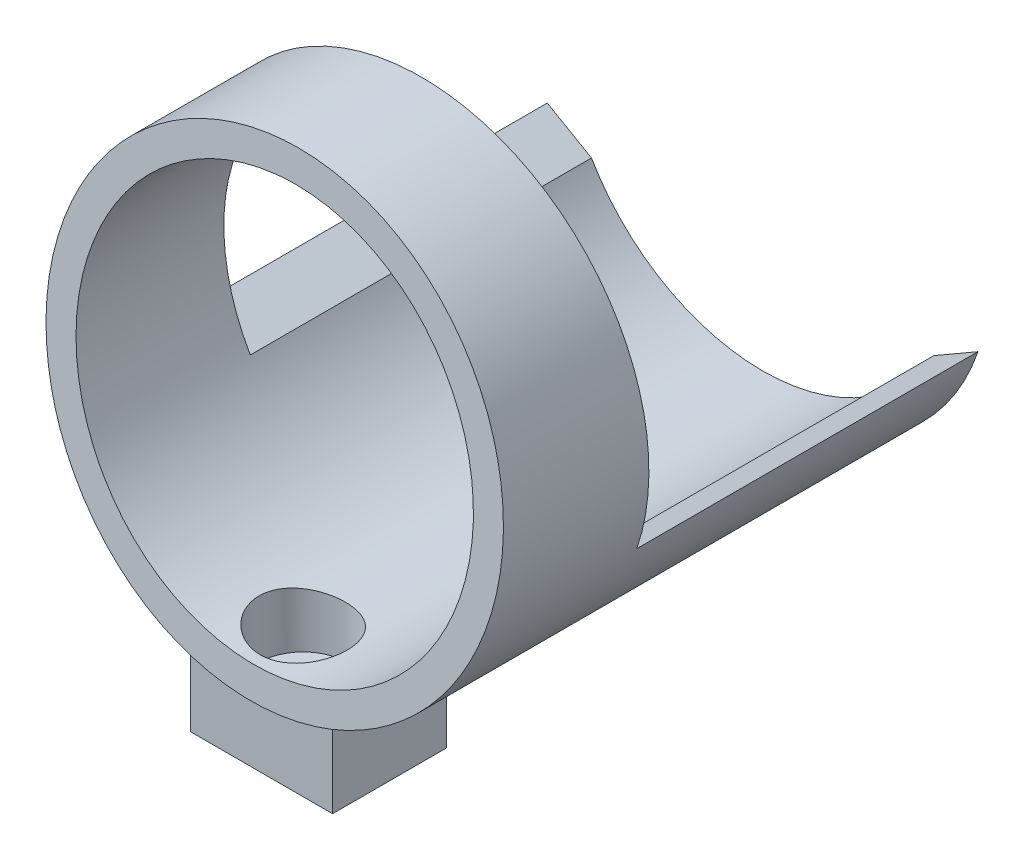
ISO-10303-21;
HEADER;
FILE_DESCRIPTION(('STEP AP214'),'2;1');
FILE_NAME('part.step','',(''),(''),'','','');
FILE_SCHEMA(('AUTOMOTIVE_DESIGN { 1 0 10303 214 1 1 1 1 }'));
ENDSEC;
DATA;
#1=APPLICATION_CONTEXT('core data for automotive mechanical design processes');
#2=APPLICATION_PROTOCOL_DEFINITION('international standard','automotive_design',2000,#1);
#3=PRODUCT_CONTEXT('',#1,'mechanical');
#4=PRODUCT('Part','Part','',(#3));
#5=PRODUCT_RELATED_PRODUCT_CATEGORY('part','',(#4));
#6=PRODUCT_DEFINITION_FORMATION('','',#4);
#7=PRODUCT_DEFINITION_CONTEXT('part definition',#1,'design');
#8=PRODUCT_DEFINITION('design','',#6,#7);
#9=PRODUCT_DEFINITION_SHAPE('','',#8);
#10=(LENGTH_UNIT() NAMED_UNIT(*) SI_UNIT(.MILLI.,.METRE.));
#11=(NAMED_UNIT(*) PLANE_ANGLE_UNIT() SI_UNIT($,.RADIAN.));
#12=(NAMED_UNIT(*) SI_UNIT($,.STERADIAN.) SOLID_ANGLE_UNIT());
#13=UNCERTAINTY_MEASURE_WITH_UNIT(LENGTH_MEASURE(1.E-05),#10,'distance_accuracy_value','');
#14=(GEOMETRIC_REPRESENTATION_CONTEXT(3) GLOBAL_UNCERTAINTY_ASSIGNED_CONTEXT((#13)) GLOBAL_UNIT_ASSIGNED_CONTEXT((#10,
#11,#12)) REPRESENTATION_CONTEXT('',''));
#15=CARTESIAN_POINT('',(0.,0.,0.));
#16=DIRECTION('',(0.,0.,1.));
#17=DIRECTION('',(1.,0.,0.));
#18=AXIS2_PLACEMENT_3D('',#15,#16,#17);
#19=CARTESIAN_POINT('',(-0.449999999999996,-25.,31.8678485556805));
#20=DIRECTION('',(0.,1.,0.));
#21=DIRECTION('',(0.,0.,1.));
#22=AXIS2_PLACEMENT_3D('',#19,#20,#21);
#23=CYLINDRICAL_SURFACE('',#22,1.7);
#24=CARTESIAN_POINT('',(-0.449999999999996,-21.,31.8678485556805));
#25=DIRECTION('',(0.,1.,0.));
#26=DIRECTION('',(0.,0.,1.));
#27=AXIS2_PLACEMENT_3D('',#24,#25,#26);
#28=CIRCLE('',#27,1.7);
#29=CARTESIAN_POINT('',(-0.449999999999996,-21.,33.5678485556805));
#30=VERTEX_POINT('',#29);
#31=EDGE_CURVE('E131',#30,#30,#28,.T.);
#32=ORIENTED_EDGE('',*,*,#31,.F.);
#33=EDGE_LOOP('',(#32));
#34=FACE_BOUND('',#33,.T.);
#35=CARTESIAN_POINT('',(-0.449999999999996,-17.5,31.8678485556805));
#36=DIRECTION('',(0.,1.,0.));
#37=DIRECTION('',(0.,0.,1.));
#38=AXIS2_PLACEMENT_3D('',#35,#36,#37);
#39=CIRCLE('',#38,1.7);
#40=CARTESIAN_POINT('',(-0.449999999999996,-17.5,33.5678485556805));
#41=VERTEX_POINT('',#40);
#42=EDGE_CURVE('E135',#41,#41,#39,.F.);
#43=ORIENTED_EDGE('',*,*,#42,.F.);
#44=EDGE_LOOP('',(#43));
#45=FACE_BOUND('',#44,.T.);
#46=ADVANCED_FACE('F35',(#34,#45),#23,.F.);
#47=CARTESIAN_POINT('',(0.,0.,36.));
#48=DIRECTION('',(0.,0.,-1.));
#49=DIRECTION('',(-1.,0.,0.));
#50=AXIS2_PLACEMENT_3D('',#47,#48,#49);
#51=CYLINDRICAL_SURFACE('',#50,16.);
#52=CARTESIAN_POINT('',(0.,0.,34.3183322357493));
#53=DIRECTION('',(0.,-0.104528463267646,-0.994521895368274));
#54=DIRECTION('',(0.,0.994521895368274,-0.104528463267646));
#55=AXIS2_PLACEMENT_3D('',#52,#53,#54);
#56=ELLIPSE('',#55,16.0881324730163,16.);
#57=CARTESIAN_POINT('',(0.,16.,32.6366644714986));
#58=VERTEX_POINT('',#57);
#59=EDGE_CURVE('E123',#58,#58,#56,.T.);
#60=ORIENTED_EDGE('',*,*,#59,.T.);
#61=EDGE_LOOP('',(#60));
#62=FACE_BOUND('',#61,.T.);
#63=CARTESIAN_POINT('',(0.,0.,24.));
#64=DIRECTION('',(0.,0.,-1.));
#65=DIRECTION('',(-1.,0.,0.));
#66=AXIS2_PLACEMENT_3D('',#63,#64,#65);
#67=CIRCLE('',#66,16.);
#68=CARTESIAN_POINT('',(-15.1468212866341,-5.15497865279463,24.));
#69=VERTEX_POINT('',#68);
#70=CARTESIAN_POINT('',(15.1468212866341,-5.15497865279463,24.));
#71=VERTEX_POINT('',#70);
#72=EDGE_CURVE('E107',#69,#71,#67,.T.);
#73=ORIENTED_EDGE('',*,*,#72,.F.);
#74=DIRECTION('',(0.,0.,-1.));
#75=VECTOR('',#74,1.);
#76=CARTESIAN_POINT('',(-15.1468212866341,-5.15497865279463,36.));
#77=LINE('',#76,#75);
#78=CARTESIAN_POINT('',(-15.1468212866341,-5.15497865279464,0.));
#79=VERTEX_POINT('',#78);
#80=EDGE_CURVE('E106',#69,#79,#77,.T.);
#81=ORIENTED_EDGE('',*,*,#80,.T.);
#82=CARTESIAN_POINT('',(0.,0.,0.));
#83=DIRECTION('',(0.,0.,1.));
#84=DIRECTION('',(1.,0.,0.));
#85=AXIS2_PLACEMENT_3D('',#82,#83,#84);
#86=CIRCLE('',#85,16.);
#87=CARTESIAN_POINT('',(15.1468212866341,-5.15497865279463,0.));
#88=VERTEX_POINT('',#87);
#89=EDGE_CURVE('E114',#79,#88,#86,.T.);
#90=ORIENTED_EDGE('',*,*,#89,.T.);
#91=DIRECTION('',(0.,0.,-1.));
#92=VECTOR('',#91,1.);
#93=CARTESIAN_POINT('',(15.1468212866341,-5.15497865279463,36.));
#94=LINE('',#93,#92);
#95=EDGE_CURVE('E99',#88,#71,#94,.F.);
#96=ORIENTED_EDGE('',*,*,#95,.T.);
#97=EDGE_LOOP('',(#73,#81,#90,#96));
#98=FACE_BOUND('',#97,.T.);
#99=CARTESIAN_POINT('',(0.,0.,27.));
#100=DIRECTION('',(0.,0.,1.));
#101=DIRECTION('',(1.,0.,0.));
#102=AXIS2_PLACEMENT_3D('',#99,#100,#101);
#103=CIRCLE('',#102,16.);
#104=CARTESIAN_POINT('',(4.75,-15.2786615905975,27.));
#105=VERTEX_POINT('',#104);
#106=CARTESIAN_POINT('',(-5.25,-15.1141490001918,27.));
#107=VERTEX_POINT('',#106);
#108=EDGE_CURVE('E58',#105,#107,#103,.F.);
#109=ORIENTED_EDGE('',*,*,#108,.T.);
#110=DIRECTION('',(0.,0.,-1.));
#111=VECTOR('',#110,1.);
#112=CARTESIAN_POINT('',(-5.25,-15.1141490001918,36.));
#113=LINE('',#112,#111);
#114=CARTESIAN_POINT('',(-5.25,-15.1141490001918,35.));
#115=VERTEX_POINT('',#114);
#116=EDGE_CURVE('E195',#107,#115,#113,.F.);
#117=ORIENTED_EDGE('',*,*,#116,.T.);
#118=CARTESIAN_POINT('',(0.,0.,35.));
#119=DIRECTION('',(0.,0.,-1.));
#120=DIRECTION('',(-1.,0.,0.));
#121=AXIS2_PLACEMENT_3D('',#118,#119,#120);
#122=CIRCLE('',#121,16.);
#123=CARTESIAN_POINT('',(4.75000000000749,-15.2786615905952,35.));
#124=VERTEX_POINT('',#123);
#125=EDGE_CURVE('E203',#115,#124,#122,.F.);
#126=ORIENTED_EDGE('',*,*,#125,.T.);
#127=DIRECTION('',(0.,0.,-1.));
#128=VECTOR('',#127,1.);
#129=CARTESIAN_POINT('',(4.75,-15.2786615905975,36.));
#130=LINE('',#129,#128);
#131=EDGE_CURVE('E191',#124,#105,#130,.T.);
#132=ORIENTED_EDGE('',*,*,#131,.T.);
#133=EDGE_LOOP('',(#109,#117,#126,#132));
#134=FACE_BOUND('',#133,.T.);
#135=ADVANCED_FACE('F37',(#62,#98,#134),#51,.T.);
#136=CARTESIAN_POINT('',(0.,0.,0.));
#137=DIRECTION('',(0.,0.,1.));
#138=DIRECTION('',(1.,0.,0.));
#139=AXIS2_PLACEMENT_3D('',#136,#137,#138);
#140=PLANE('',#139);
#141=ORIENTED_EDGE('',*,*,#89,.F.);
#142=DIRECTION('',(-0.866025403784438,0.500000000000001,0.));
#143=VECTOR('',#142,1.);
#144=CARTESIAN_POINT('',(0.,-13.9,0.));
#145=LINE('',#144,#143);
#146=CARTESIAN_POINT('',(-12.0377531126037,-6.94999999999997,0.));
#147=VERTEX_POINT('',#146);
#148=EDGE_CURVE('E116',#147,#79,#145,.T.);
#149=ORIENTED_EDGE('',*,*,#148,.F.);
#150=CARTESIAN_POINT('',(0.,0.,0.));
#151=DIRECTION('',(0.,0.,-1.));
#152=DIRECTION('',(-1.,0.,0.));
#153=AXIS2_PLACEMENT_3D('',#150,#151,#152);
#154=CIRCLE('',#153,13.9);
#155=CARTESIAN_POINT('',(12.0377531126037,-6.94999999999997,0.));
#156=VERTEX_POINT('',#155);
#157=EDGE_CURVE('E115',#156,#147,#154,.T.);
#158=ORIENTED_EDGE('',*,*,#157,.F.);
#159=DIRECTION('',(-0.866025403784438,-0.500000000000001,0.));
#160=VECTOR('',#159,1.);
#161=CARTESIAN_POINT('',(51.7883191463093,16.,0.));
#162=LINE('',#161,#160);
#163=EDGE_CURVE('E102',#88,#156,#162,.T.);
#164=ORIENTED_EDGE('',*,*,#163,.F.);
#165=EDGE_LOOP('',(#141,#149,#158,#164));
#166=FACE_BOUND('',#165,.T.);
#167=ADVANCED_FACE('F112',(#166),#140,.F.);
#168=CARTESIAN_POINT('',(0.,0.,36.));
#169=DIRECTION('',(0.,0.,-1.));
#170=DIRECTION('',(-1.,0.,0.));
#171=AXIS2_PLACEMENT_3D('',#168,#169,#170);
#172=CYLINDRICAL_SURFACE('',#171,13.9);
#173=ORIENTED_EDGE('',*,*,#157,.T.);
#174=DIRECTION('',(0.,0.,-1.));
#175=VECTOR('',#174,1.);
#176=CARTESIAN_POINT('',(-12.0377531126037,-6.94999999999998,36.));
#177=LINE('',#176,#175);
#178=CARTESIAN_POINT('',(-12.0377531126037,-6.94999999999997,24.));
#179=VERTEX_POINT('',#178);
#180=EDGE_CURVE('E11',#147,#179,#177,.F.);
#181=ORIENTED_EDGE('',*,*,#180,.T.);
#182=CARTESIAN_POINT('',(0.,0.,24.));
#183=DIRECTION('',(0.,0.,-1.));
#184=DIRECTION('',(-1.,0.,0.));
#185=AXIS2_PLACEMENT_3D('',#182,#183,#184);
#186=CIRCLE('',#185,13.9);
#187=CARTESIAN_POINT('',(12.0377531126037,-6.94999999999997,24.));
#188=VERTEX_POINT('',#187);
#189=EDGE_CURVE('E120',#188,#179,#186,.F.);
#190=ORIENTED_EDGE('',*,*,#189,.F.);
#191=DIRECTION('',(0.,0.,-1.));
#192=VECTOR('',#191,1.);
#193=CARTESIAN_POINT('',(12.0377531126037,-6.94999999999997,36.));
#194=LINE('',#193,#192);
#195=EDGE_CURVE('E43',#188,#156,#194,.T.);
#196=ORIENTED_EDGE('',*,*,#195,.T.);
#197=EDGE_LOOP('',(#173,#181,#190,#196));
#198=FACE_BOUND('',#197,.T.);
#199=CARTESIAN_POINT('',(-0.449999999999996,-13.892713917734,34.9678485556805));
#200=CARTESIAN_POINT('',(-0.622660651205395,-13.8871178568768,34.9678424798735));
#201=CARTESIAN_POINT('',(-0.79528976167752,-13.8782744219129,34.9533742551843));
#202=CARTESIAN_POINT('',(-1.13542413378188,-13.8546003652704,34.8960474923244));
#203=CARTESIAN_POINT('',(-1.30292531892318,-13.8397651068141,34.8531669507603));
#204=CARTESIAN_POINT('',(-1.62785138764153,-13.8053166964395,34.7405115555077));
#205=CARTESIAN_POINT('',(-1.78528867276532,-13.7857095739213,34.6707705765499));
#206=CARTESIAN_POINT('',(-2.08615108061079,-13.7434014584898,34.5064838295259));
#207=CARTESIAN_POINT('',(-2.22957652729288,-13.7207005371358,34.4119386351313));
#208=CARTESIAN_POINT('',(-2.50115470890942,-13.6738279051023,34.1987463894875));
#209=CARTESIAN_POINT('',(-2.62899468062076,-13.6496373557188,34.079704906306));
#210=CARTESIAN_POINT('',(-2.86302311524449,-13.6024770676805,33.8217301424302));
#211=CARTESIAN_POINT('',(-2.96920965421018,-13.5795074376406,33.682795096022));
#212=CARTESIAN_POINT('',(-3.15776642378658,-13.5369113048167,33.3873769751668));
#213=CARTESIAN_POINT('',(-3.23992121482813,-13.5173156550417,33.230751630717));
#214=CARTESIAN_POINT('',(-3.37657311551639,-13.4838325208915,32.9052980748328));
#215=CARTESIAN_POINT('',(-3.43107527787502,-13.4699439937941,32.7364720991534));
#216=CARTESIAN_POINT('',(-3.50961764471065,-13.4496916270066,32.3956656933361));
#217=CARTESIAN_POINT('',(-3.53434920382749,-13.4431572484548,32.2238548594581));
#218=CARTESIAN_POINT('',(-3.55480498274946,-13.4377633629282,31.8784080141109));
#219=CARTESIAN_POINT('',(-3.55053386134706,-13.4389026233123,31.7047723002519));
#220=CARTESIAN_POINT('',(-3.51360032343009,-13.4486039445483,31.3649921199866));
#221=CARTESIAN_POINT('',(-3.48161910212449,-13.4569878964874,31.1987678009866));
#222=CARTESIAN_POINT('',(-3.39124397991698,-13.4800452198484,30.8741284792428));
#223=CARTESIAN_POINT('',(-3.33284830284784,-13.4947190142099,30.7157140024449));
#224=CARTESIAN_POINT('',(-3.19067248418592,-13.5290423181834,30.4092327770392));
#225=CARTESIAN_POINT('',(-3.10662695208989,-13.5487434772686,30.2612951493008));
#226=CARTESIAN_POINT('',(-2.91576215361656,-13.5910949426868,29.9813903884217));
#227=CARTESIAN_POINT('',(-2.80893891807978,-13.6137457627489,29.8494260450184));
#228=CARTESIAN_POINT('',(-2.57182512852147,-13.6605532907932,29.6010897979941));
#229=CARTESIAN_POINT('',(-2.440931657336,-13.6847347451336,29.4852976207892));
#230=CARTESIAN_POINT('',(-2.16140135603753,-13.7316568999293,29.2771982822592));
#231=CARTESIAN_POINT('',(-2.01276343940243,-13.7543975120286,29.1848925601338));
#232=CARTESIAN_POINT('',(-1.70044498084514,-13.7965023686536,29.0257832712451));
#233=CARTESIAN_POINT('',(-1.53665527336365,-13.8158386367196,28.9591860944412));
#234=CARTESIAN_POINT('',(-1.19964888474066,-13.8491688559582,28.8546880676339));
#235=CARTESIAN_POINT('',(-1.02643365691331,-13.8631636280804,28.816782807008));
#236=CARTESIAN_POINT('',(-0.679433991058106,-13.8844494165227,28.7715090343854));
#237=CARTESIAN_POINT('',(-0.505740850859318,-13.8918773243052,28.7635051522236));
#238=CARTESIAN_POINT('',(-0.159311629055266,-13.9001665947851,28.7766451984144));
#239=CARTESIAN_POINT('',(0.0134245520977184,-13.9010286538176,28.7977860355697));
#240=CARTESIAN_POINT('',(0.349904796825192,-13.8965971339684,28.8679845797261));
#241=CARTESIAN_POINT('',(0.513752703010522,-13.8914097432958,28.9165532142652));
#242=CARTESIAN_POINT('',(0.8310595912716,-13.8760438652242,29.0397998370894));
#243=CARTESIAN_POINT('',(0.984517988980241,-13.8658650973457,29.114479292547));
#244=CARTESIAN_POINT('',(1.27827382000474,-13.8418914982808,29.2886058447456));
#245=CARTESIAN_POINT('',(1.41843711795887,-13.8280642467354,29.3882745791678));
#246=CARTESIAN_POINT('',(1.68030195764806,-13.7986948132298,29.6092703811009));
#247=CARTESIAN_POINT('',(1.80200127022148,-13.7831524245913,29.7306000599002));
#248=CARTESIAN_POINT('',(2.02578731490764,-13.7520621183024,29.9941090329159));
#249=CARTESIAN_POINT('',(2.12747122846929,-13.7365193784673,30.1366313888641));
#250=CARTESIAN_POINT('',(2.3055226836426,-13.7077617197511,30.4369183613727));
#251=CARTESIAN_POINT('',(2.38189056606967,-13.6945467695335,30.594682772701));
#252=CARTESIAN_POINT('',(2.50700005102259,-13.6721985336317,30.9209365346765));
#253=CARTESIAN_POINT('',(2.55576605992172,-13.6630616435257,31.089416263411));
#254=CARTESIAN_POINT('',(2.62423617403487,-13.6500776294358,31.4323727636871));
#255=CARTESIAN_POINT('',(2.64394383575648,-13.6462298581103,31.6068487986539));
#256=CARTESIAN_POINT('',(2.65358345325882,-13.6443583502173,31.9537373713282));
#257=CARTESIAN_POINT('',(2.64400529186315,-13.6462387921716,32.1261359514902));
#258=CARTESIAN_POINT('',(2.59644362427527,-13.6553673003886,32.4668167275514));
#259=CARTESIAN_POINT('',(2.55846029779882,-13.6626153326911,32.6350989494873));
#260=CARTESIAN_POINT('',(2.45541213336017,-13.6815080470977,32.9623481659503));
#261=CARTESIAN_POINT('',(2.39042482556777,-13.6931401334816,33.1213403540456));
#262=CARTESIAN_POINT('',(2.2352627376409,-13.719320803035,33.426255929564));
#263=CARTESIAN_POINT('',(2.14508577258662,-13.7338696391689,33.5721781818663));
#264=CARTESIAN_POINT('',(1.94039549760206,-13.7642911081691,33.8493002331927));
#265=CARTESIAN_POINT('',(1.82551918798528,-13.7801810651301,33.980230091649));
#266=CARTESIAN_POINT('',(1.57540215966993,-13.8110083614725,34.2211221297189));
#267=CARTESIAN_POINT('',(1.44015750829453,-13.8259455160943,34.3310802508408));
#268=CARTESIAN_POINT('',(1.15190625819617,-13.8529490831056,34.5276523223548));
#269=CARTESIAN_POINT('',(0.998776056356036,-13.8649935182313,34.6140881845372));
#270=CARTESIAN_POINT('',(0.679942747182857,-13.884275001125,34.7598896404602));
#271=CARTESIAN_POINT('',(0.514250517438708,-13.8915161563017,34.8192783492619));
#272=CARTESIAN_POINT('',(0.215252220165557,-13.8989389009638,34.8985937014254));
#273=CARTESIAN_POINT('',(0.0835370690898138,-13.9003836938166,34.9245270882187));
#274=CARTESIAN_POINT('',(-0.182125095416021,-13.8994414927102,34.9591565918113));
#275=CARTESIAN_POINT('',(-0.31607203620825,-13.8970546232198,34.9678532685115));
#276=CARTESIAN_POINT('',(-0.449999999999996,-13.892713917734,34.9678485556805));
#277=B_SPLINE_CURVE_WITH_KNOTS('',3,(#199,#200,#201,#202,#203,#204,#205,#206,#207,#208,#209,
#210,#211,#212,#213,#214,#215,#216,#217,#218,#219,#220,#221,#222,#223,#224,#225,#226,#227,#228,
#229,#230,#231,#232,#233,#234,#235,#236,#237,#238,#239,#240,#241,#242,#243,#244,#245,#246,#247,
#248,#249,#250,#251,#252,#253,#254,#255,#256,#257,#258,#259,#260,#261,#262,#263,#264,#265,#266,
#267,#268,#269,#270,#271,#272,#273,#274,#275,#276),.UNSPECIFIED.,.T.,.F.,(4,2,2,2,2,2,2,2,2,2,2,
2,2,2,2,2,2,2,2,2,2,2,2,2,2,2,2,2,2,2,2,2,2,2,2,2,2,2,4),(0.,0.517759573159455,1.03592058502962,
1.55343025263574,2.07092795233814,2.59752179428676,3.12416240468432,3.65538890115547,
4.18651829647903,4.70505955253025,5.22351751562717,5.72958064291576,6.23567780408332,
6.7471999028009,7.25881121044417,7.78562231979684,8.3124657032367,8.84345477468026,
9.37436220402585,9.89392211642961,10.413426926617,10.9239482318998,11.4344982280909,
11.9497473848825,12.4650586984193,12.9898676636658,13.5146695634191,14.0390066903216,
14.5632796372553,15.0788309882354,15.594379077417,16.1084571115265,16.6225797499845,
17.1448493915658,17.6672200014626,18.1934419283261,18.7192132871353,19.1208377305054,
19.5224491276757),.UNSPECIFIED.);
#278=CARTESIAN_POINT('',(-0.449999999999996,-13.892713917734,34.9678485556805));
#279=VERTEX_POINT('',#278);
#280=EDGE_CURVE('E134',#279,#279,#277,.T.);
#281=ORIENTED_EDGE('',*,*,#280,.T.);
#282=EDGE_LOOP('',(#281));
#283=FACE_BOUND('',#282,.T.);
#284=CARTESIAN_POINT('',(0.,0.,34.3183322357493));
#285=DIRECTION('',(0.,-0.104528463267646,-0.994521895368274));
#286=DIRECTION('',(0.,0.994521895368274,-0.104528463267646));
#287=AXIS2_PLACEMENT_3D('',#284,#285,#286);
#288=ELLIPSE('',#287,13.9765650859329,13.9);
#289=CARTESIAN_POINT('',(0.,13.9,32.8573833655565));
#290=VERTEX_POINT('',#289);
#291=EDGE_CURVE('E127',#290,#290,#288,.F.);
#292=ORIENTED_EDGE('',*,*,#291,.T.);
#293=EDGE_LOOP('',(#292));
#294=FACE_BOUND('',#293,.T.);
#295=ADVANCED_FACE('F144',(#198,#283,#294),#172,.F.);
#296=CARTESIAN_POINT('',(-16.,16.,32.6366644714986));
#297=DIRECTION('',(0.,-0.104528463267646,-0.994521895368274));
#298=DIRECTION('',(0.,0.994521895368274,-0.104528463267646));
#299=AXIS2_PLACEMENT_3D('',#296,#297,#298);
#300=PLANE('',#299);
#301=ORIENTED_EDGE('',*,*,#291,.F.);
#302=EDGE_LOOP('',(#301));
#303=FACE_BOUND('',#302,.T.);
#304=ORIENTED_EDGE('',*,*,#59,.F.);
#305=EDGE_LOOP('',(#304));
#306=FACE_BOUND('',#305,.T.);
#307=ADVANCED_FACE('F164',(#303,#306),#300,.F.);
#308=CARTESIAN_POINT('',(-5.25,500000.,35.));
#309=DIRECTION('',(1.,0.,0.));
#310=DIRECTION('',(0.,0.,-1.));
#311=AXIS2_PLACEMENT_3D('',#308,#309,#310);
#312=PLANE('',#311);
#313=ORIENTED_EDGE('',*,*,#116,.F.);
#314=DIRECTION('',(0.,-1.,0.));
#315=VECTOR('',#314,1.);
#316=CARTESIAN_POINT('',(-5.25,500000.,27.));
#317=LINE('',#316,#315);
#318=CARTESIAN_POINT('',(-5.25,-21.,27.));
#319=VERTEX_POINT('',#318);
#320=EDGE_CURVE('E199',#107,#319,#317,.T.);
#321=ORIENTED_EDGE('',*,*,#320,.T.);
#322=DIRECTION('',(0.,0.,1.));
#323=VECTOR('',#322,1.);
#324=CARTESIAN_POINT('',(-5.25,-21.,35.));
#325=LINE('',#324,#323);
#326=CARTESIAN_POINT('',(-5.25,-21.,35.));
#327=VERTEX_POINT('',#326);
#328=EDGE_CURVE('E130',#319,#327,#325,.T.);
#329=ORIENTED_EDGE('',*,*,#328,.T.);
#330=DIRECTION('',(0.,-1.,0.));
#331=VECTOR('',#330,1.);
#332=CARTESIAN_POINT('',(-5.25,500000.,35.));
#333=LINE('',#332,#331);
#334=EDGE_CURVE('E192',#115,#327,#333,.T.);
#335=ORIENTED_EDGE('',*,*,#334,.F.);
#336=EDGE_LOOP('',(#313,#321,#329,#335));
#337=FACE_BOUND('',#336,.T.);
#338=ADVANCED_FACE('F155',(#337),#312,.F.);
#339=CARTESIAN_POINT('',(4.75,500000.,35.));
#340=DIRECTION('',(-1.,0.,0.));
#341=DIRECTION('',(0.,0.,1.));
#342=AXIS2_PLACEMENT_3D('',#339,#340,#341);
#343=PLANE('',#342);
#344=ORIENTED_EDGE('',*,*,#131,.F.);
#345=DIRECTION('',(0.,-1.,0.));
#346=VECTOR('',#345,1.);
#347=CARTESIAN_POINT('',(4.75,500000.,35.));
#348=LINE('',#347,#346);
#349=CARTESIAN_POINT('',(4.75,-21.,35.));
#350=VERTEX_POINT('',#349);
#351=EDGE_CURVE('E194',#124,#350,#348,.T.);
#352=ORIENTED_EDGE('',*,*,#351,.T.);
#353=DIRECTION('',(0.,0.,-1.));
#354=VECTOR('',#353,1.);
#355=CARTESIAN_POINT('',(4.75,-21.,35.));
#356=LINE('',#355,#354);
#357=CARTESIAN_POINT('',(4.75,-21.,27.));
#358=VERTEX_POINT('',#357);
#359=EDGE_CURVE('E209',#350,#358,#356,.T.);
#360=ORIENTED_EDGE('',*,*,#359,.T.);
#361=DIRECTION('',(0.,-1.,0.));
#362=VECTOR('',#361,1.);
#363=CARTESIAN_POINT('',(4.75,500000.,27.));
#364=LINE('',#363,#362);
#365=EDGE_CURVE('E197',#105,#358,#364,.T.);
#366=ORIENTED_EDGE('',*,*,#365,.F.);
#367=EDGE_LOOP('',(#344,#352,#360,#366));
#368=FACE_BOUND('',#367,.T.);
#369=ADVANCED_FACE('F171',(#368),#343,.F.);
#370=CARTESIAN_POINT('',(4.75,500000.,27.));
#371=DIRECTION('',(0.,0.,1.));
#372=DIRECTION('',(1.,0.,0.));
#373=AXIS2_PLACEMENT_3D('',#370,#371,#372);
#374=PLANE('',#373);
#375=ORIENTED_EDGE('',*,*,#108,.F.);
#376=ORIENTED_EDGE('',*,*,#365,.T.);
#377=DIRECTION('',(-1.,0.,0.));
#378=VECTOR('',#377,1.);
#379=CARTESIAN_POINT('',(4.75,-21.,27.));
#380=LINE('',#379,#378);
#381=EDGE_CURVE('E206',#358,#319,#380,.T.);
#382=ORIENTED_EDGE('',*,*,#381,.T.);
#383=ORIENTED_EDGE('',*,*,#320,.F.);
#384=EDGE_LOOP('',(#375,#376,#382,#383));
#385=FACE_BOUND('',#384,.T.);
#386=ADVANCED_FACE('F167',(#385),#374,.F.);
#387=CARTESIAN_POINT('',(4.75,500000.,35.));
#388=DIRECTION('',(0.,0.,-1.));
#389=DIRECTION('',(-1.,0.,0.));
#390=AXIS2_PLACEMENT_3D('',#387,#388,#389);
#391=PLANE('',#390);
#392=ORIENTED_EDGE('',*,*,#125,.F.);
#393=ORIENTED_EDGE('',*,*,#334,.T.);
#394=DIRECTION('',(1.,0.,0.));
#395=VECTOR('',#394,1.);
#396=CARTESIAN_POINT('',(4.75,-21.,35.));
#397=LINE('',#396,#395);
#398=EDGE_CURVE('E201',#327,#350,#397,.T.);
#399=ORIENTED_EDGE('',*,*,#398,.T.);
#400=ORIENTED_EDGE('',*,*,#351,.F.);
#401=EDGE_LOOP('',(#392,#393,#399,#400));
#402=FACE_BOUND('',#401,.T.);
#403=ADVANCED_FACE('F162',(#402),#391,.F.);
#404=CARTESIAN_POINT('',(0.,-21.,0.));
#405=DIRECTION('',(0.,1.,0.));
#406=DIRECTION('',(0.,0.,1.));
#407=AXIS2_PLACEMENT_3D('',#404,#405,#406);
#408=PLANE('',#407);
#409=ORIENTED_EDGE('',*,*,#31,.T.);
#410=EDGE_LOOP('',(#409));
#411=FACE_BOUND('',#410,.T.);
#412=ORIENTED_EDGE('',*,*,#328,.F.);
#413=ORIENTED_EDGE('',*,*,#381,.F.);
#414=ORIENTED_EDGE('',*,*,#359,.F.);
#415=ORIENTED_EDGE('',*,*,#398,.F.);
#416=EDGE_LOOP('',(#412,#413,#414,#415));
#417=FACE_BOUND('',#416,.T.);
#418=ADVANCED_FACE('F153',(#411,#417),#408,.F.);
#419=CARTESIAN_POINT('',(-0.449999999999996,-17.5,31.8678485556805));
#420=DIRECTION('',(0.,1.,0.));
#421=DIRECTION('',(0.,0.,1.));
#422=AXIS2_PLACEMENT_3D('',#419,#420,#421);
#423=CYLINDRICAL_SURFACE('',#422,3.1);
#424=CARTESIAN_POINT('',(-0.449999999999996,-17.5,31.8678485556805));
#425=DIRECTION('',(0.,1.,0.));
#426=DIRECTION('',(0.,0.,1.));
#427=AXIS2_PLACEMENT_3D('',#424,#425,#426);
#428=CIRCLE('',#427,3.1);
#429=CARTESIAN_POINT('',(-0.449999999999996,-17.5,34.9678485556805));
#430=VERTEX_POINT('',#429);
#431=EDGE_CURVE('E138',#430,#430,#428,.T.);
#432=ORIENTED_EDGE('',*,*,#431,.F.);
#433=EDGE_LOOP('',(#432));
#434=FACE_BOUND('',#433,.T.);
#435=ORIENTED_EDGE('',*,*,#280,.F.);
#436=EDGE_LOOP('',(#435));
#437=FACE_BOUND('',#436,.T.);
#438=ADVANCED_FACE('F147',(#434,#437),#423,.F.);
#439=CARTESIAN_POINT('',(-0.449999999999996,-17.5,31.8678485556805));
#440=DIRECTION('',(0.,1.,0.));
#441=DIRECTION('',(0.,0.,1.));
#442=AXIS2_PLACEMENT_3D('',#439,#440,#441);
#443=PLANE('',#442);
#444=ORIENTED_EDGE('',*,*,#431,.T.);
#445=EDGE_LOOP('',(#444));
#446=FACE_BOUND('',#445,.T.);
#447=ORIENTED_EDGE('',*,*,#42,.T.);
#448=EDGE_LOOP('',(#447));
#449=FACE_BOUND('',#448,.T.);
#450=ADVANCED_FACE('F152',(#446,#449),#443,.T.);
#451=CARTESIAN_POINT('',(0.,-13.9,24.));
#452=DIRECTION('',(-0.500000000000001,-0.866025403784438,0.));
#453=DIRECTION('',(0.866025403784438,-0.500000000000001,0.));
#454=AXIS2_PLACEMENT_3D('',#451,#452,#453);
#455=PLANE('',#454);
#456=DIRECTION('',(-0.866025403784438,0.500000000000001,0.));
#457=VECTOR('',#456,1.);
#458=CARTESIAN_POINT('',(0.,-13.9,24.));
#459=LINE('',#458,#457);
#460=EDGE_CURVE('E220',#179,#69,#459,.T.);
#461=ORIENTED_EDGE('',*,*,#460,.F.);
#462=ORIENTED_EDGE('',*,*,#180,.F.);
#463=ORIENTED_EDGE('',*,*,#148,.T.);
#464=ORIENTED_EDGE('',*,*,#80,.F.);
#465=EDGE_LOOP('',(#461,#462,#463,#464));
#466=FACE_BOUND('',#465,.T.);
#467=ADVANCED_FACE('F229',(#466),#455,.F.);
#468=CARTESIAN_POINT('',(51.7883191463093,16.,24.));
#469=DIRECTION('',(0.500000000000001,-0.866025403784438,0.));
#470=DIRECTION('',(0.866025403784438,0.500000000000001,0.));
#471=AXIS2_PLACEMENT_3D('',#468,#469,#470);
#472=PLANE('',#471);
#473=ORIENTED_EDGE('',*,*,#163,.T.);
#474=ORIENTED_EDGE('',*,*,#195,.F.);
#475=DIRECTION('',(-0.866025403784438,-0.500000000000001,0.));
#476=VECTOR('',#475,1.);
#477=CARTESIAN_POINT('',(51.7883191463093,16.,24.));
#478=LINE('',#477,#476);
#479=EDGE_CURVE('E50',#71,#188,#478,.T.);
#480=ORIENTED_EDGE('',*,*,#479,.F.);
#481=ORIENTED_EDGE('',*,*,#95,.F.);
#482=EDGE_LOOP('',(#473,#474,#480,#481));
#483=FACE_BOUND('',#482,.T.);
#484=ADVANCED_FACE('F101',(#483),#472,.F.);
#485=CARTESIAN_POINT('',(0.,0.,24.));
#486=DIRECTION('',(0.,0.,-1.));
#487=DIRECTION('',(-1.,0.,0.));
#488=AXIS2_PLACEMENT_3D('',#485,#486,#487);
#489=PLANE('',#488);
#490=ORIENTED_EDGE('',*,*,#72,.T.);
#491=ORIENTED_EDGE('',*,*,#479,.T.);
#492=ORIENTED_EDGE('',*,*,#189,.T.);
#493=ORIENTED_EDGE('',*,*,#460,.T.);
#494=EDGE_LOOP('',(#490,#491,#492,#493));
#495=FACE_BOUND('',#494,.T.);
#496=ADVANCED_FACE('F225',(#495),#489,.T.);
#497=CLOSED_SHELL('',(#46,#135,#167,#295,#307,#338,#369,#386,#403,#418,#438,#450,#467,#484,#496));
#498=MANIFOLD_SOLID_BREP('B2',#497);
#499=ADVANCED_BREP_SHAPE_REPRESENTATION('',(#18,#498),#14);
#500=SHAPE_DEFINITION_REPRESENTATION(#9,#499);
ENDSEC;
END-ISO-10303-21;
